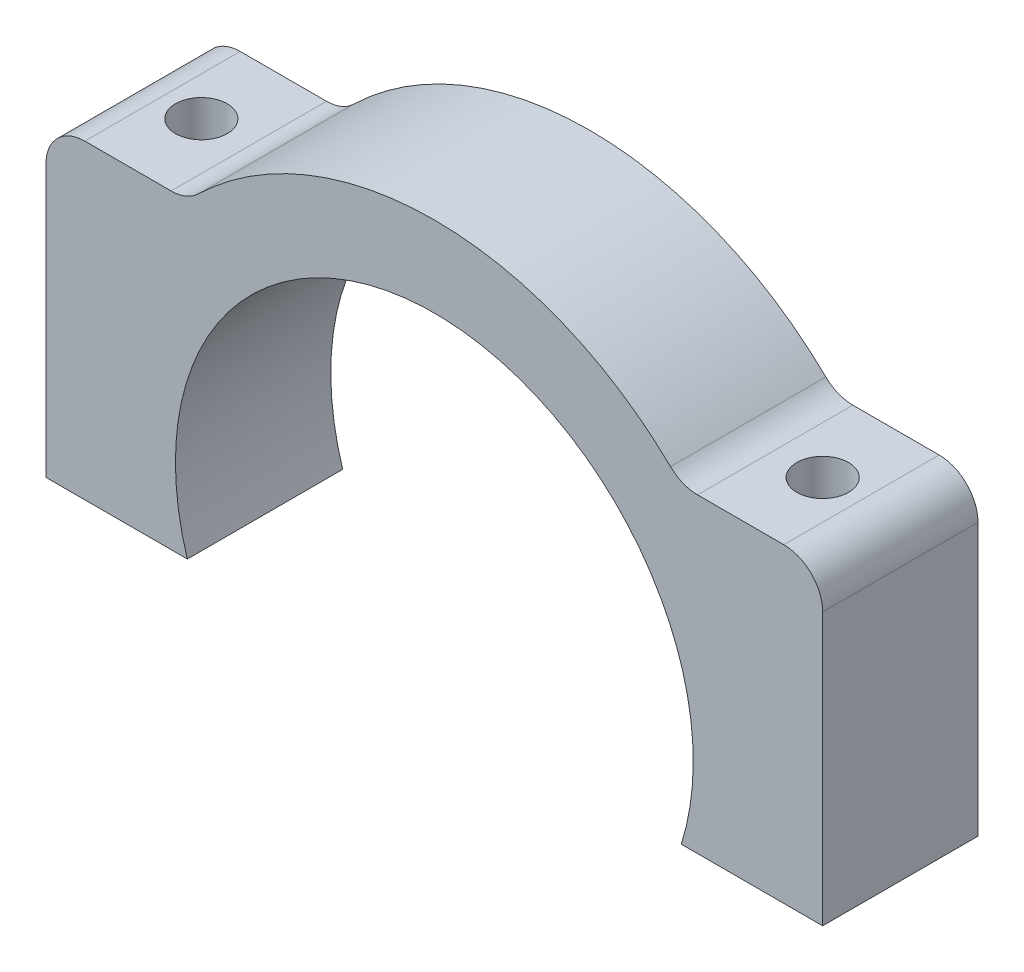
ISO-10303-21;
HEADER;
FILE_DESCRIPTION(('STEP AP214'),'2;1');
FILE_NAME('part.step','',(''),(''),'','','');
FILE_SCHEMA(('AUTOMOTIVE_DESIGN { 1 0 10303 214 1 1 1 1 }'));
ENDSEC;
DATA;
#1=APPLICATION_CONTEXT('core data for automotive mechanical design processes');
#2=APPLICATION_PROTOCOL_DEFINITION('international standard','automotive_design',2000,#1);
#3=PRODUCT_CONTEXT('',#1,'mechanical');
#4=PRODUCT('Part','Part','',(#3));
#5=PRODUCT_RELATED_PRODUCT_CATEGORY('part','',(#4));
#6=PRODUCT_DEFINITION_FORMATION('','',#4);
#7=PRODUCT_DEFINITION_CONTEXT('part definition',#1,'design');
#8=PRODUCT_DEFINITION('design','',#6,#7);
#9=PRODUCT_DEFINITION_SHAPE('','',#8);
#10=(LENGTH_UNIT() NAMED_UNIT(*) SI_UNIT(.MILLI.,.METRE.));
#11=(NAMED_UNIT(*) PLANE_ANGLE_UNIT() SI_UNIT($,.RADIAN.));
#12=(NAMED_UNIT(*) SI_UNIT($,.STERADIAN.) SOLID_ANGLE_UNIT());
#13=UNCERTAINTY_MEASURE_WITH_UNIT(LENGTH_MEASURE(1.E-05),#10,'distance_accuracy_value','');
#14=(GEOMETRIC_REPRESENTATION_CONTEXT(3) GLOBAL_UNCERTAINTY_ASSIGNED_CONTEXT((#13)) GLOBAL_UNIT_ASSIGNED_CONTEXT((#10,
#11,#12)) REPRESENTATION_CONTEXT('',''));
#15=CARTESIAN_POINT('',(0.,0.,0.));
#16=DIRECTION('',(0.,0.,1.));
#17=DIRECTION('',(1.,0.,0.));
#18=AXIS2_PLACEMENT_3D('',#15,#16,#17);
#19=CARTESIAN_POINT('',(-183.47102718992,6.00000000000001,12.));
#20=DIRECTION('',(0.,0.,-1.));
#21=DIRECTION('',(-1.,0.,0.));
#22=AXIS2_PLACEMENT_3D('',#19,#20,#21);
#23=CYLINDRICAL_SURFACE('',#22,20.0000000000001);
#24=CARTESIAN_POINT('',(-183.47102718992,6.00000000000001,0.));
#25=DIRECTION('',(0.,0.,-1.));
#26=DIRECTION('',(-1.,0.,0.));
#27=AXIS2_PLACEMENT_3D('',#24,#25,#26);
#28=CIRCLE('',#27,20.0000000000001);
#29=CARTESIAN_POINT('',(-202.549811218259,0.,0.));
#30=VERTEX_POINT('',#29);
#31=CARTESIAN_POINT('',(-164.392243161581,0.,0.));
#32=VERTEX_POINT('',#31);
#33=EDGE_CURVE('E152',#30,#32,#28,.T.);
#34=ORIENTED_EDGE('',*,*,#33,.T.);
#35=DIRECTION('',(0.,0.,-1.));
#36=VECTOR('',#35,1.);
#37=CARTESIAN_POINT('',(-164.392243161581,0.,12.));
#38=LINE('',#37,#36);
#39=CARTESIAN_POINT('',(-164.392243161581,0.,12.));
#40=VERTEX_POINT('',#39);
#41=EDGE_CURVE('E133',#40,#32,#38,.T.);
#42=ORIENTED_EDGE('',*,*,#41,.F.);
#43=CARTESIAN_POINT('',(-183.47102718992,6.00000000000001,12.));
#44=DIRECTION('',(0.,0.,-1.));
#45=DIRECTION('',(-1.,0.,0.));
#46=AXIS2_PLACEMENT_3D('',#43,#44,#45);
#47=CIRCLE('',#46,20.0000000000001);
#48=CARTESIAN_POINT('',(-202.549811218259,0.,12.));
#49=VERTEX_POINT('',#48);
#50=EDGE_CURVE('E140',#49,#40,#47,.T.);
#51=ORIENTED_EDGE('',*,*,#50,.F.);
#52=DIRECTION('',(0.,0.,-1.));
#53=VECTOR('',#52,1.);
#54=CARTESIAN_POINT('',(-202.549811218259,0.,12.));
#55=LINE('',#54,#53);
#56=EDGE_CURVE('E223',#49,#30,#55,.T.);
#57=ORIENTED_EDGE('',*,*,#56,.T.);
#58=EDGE_LOOP('',(#34,#42,#51,#57));
#59=FACE_BOUND('',#58,.T.);
#60=ADVANCED_FACE('F39',(#59),#23,.F.);
#61=CARTESIAN_POINT('',(-153.472243161581,0.,12.));
#62=DIRECTION('',(0.,1.,0.));
#63=DIRECTION('',(-1.,0.,0.));
#64=AXIS2_PLACEMENT_3D('',#61,#62,#63);
#65=PLANE('',#64);
#66=CARTESIAN_POINT('',(-159.472243161581,0.,6.00000000015));
#67=DIRECTION('',(0.,1.,0.));
#68=DIRECTION('',(-1.,0.,0.));
#69=AXIS2_PLACEMENT_3D('',#66,#67,#68);
#70=CIRCLE('',#69,2.);
#71=CARTESIAN_POINT('',(-161.472243161581,0.,6.00000000015));
#72=VERTEX_POINT('',#71);
#73=EDGE_CURVE('E253',#72,#72,#70,.F.);
#74=ORIENTED_EDGE('',*,*,#73,.F.);
#75=EDGE_LOOP('',(#74));
#76=FACE_BOUND('',#75,.T.);
#77=DIRECTION('',(1.,0.,0.));
#78=VECTOR('',#77,1.);
#79=CARTESIAN_POINT('',(-153.472243161581,0.,0.));
#80=LINE('',#79,#78);
#81=CARTESIAN_POINT('',(-153.472243161581,0.,0.));
#82=VERTEX_POINT('',#81);
#83=EDGE_CURVE('E225',#32,#82,#80,.T.);
#84=ORIENTED_EDGE('',*,*,#83,.T.);
#85=DIRECTION('',(0.,0.,-1.));
#86=VECTOR('',#85,1.);
#87=CARTESIAN_POINT('',(-153.472243161581,0.,12.));
#88=LINE('',#87,#86);
#89=CARTESIAN_POINT('',(-153.472243161581,0.,12.));
#90=VERTEX_POINT('',#89);
#91=EDGE_CURVE('E136',#90,#82,#88,.T.);
#92=ORIENTED_EDGE('',*,*,#91,.F.);
#93=DIRECTION('',(1.,0.,0.));
#94=VECTOR('',#93,1.);
#95=CARTESIAN_POINT('',(-153.472243161581,0.,12.));
#96=LINE('',#95,#94);
#97=EDGE_CURVE('E129',#40,#90,#96,.T.);
#98=ORIENTED_EDGE('',*,*,#97,.F.);
#99=ORIENTED_EDGE('',*,*,#41,.T.);
#100=EDGE_LOOP('',(#84,#92,#98,#99));
#101=FACE_BOUND('',#100,.T.);
#102=ADVANCED_FACE('F131',(#76,#101),#65,.F.);
#103=CARTESIAN_POINT('',(-153.472243161581,24.,12.));
#104=DIRECTION('',(-1.,0.,0.));
#105=DIRECTION('',(0.,0.,1.));
#106=AXIS2_PLACEMENT_3D('',#103,#104,#105);
#107=PLANE('',#106);
#108=DIRECTION('',(0.,1.,0.));
#109=VECTOR('',#108,1.);
#110=CARTESIAN_POINT('',(-153.472243161581,24.,0.));
#111=LINE('',#110,#109);
#112=CARTESIAN_POINT('',(-153.472243161581,21.,0.));
#113=VERTEX_POINT('',#112);
#114=EDGE_CURVE('E203',#82,#113,#111,.T.);
#115=ORIENTED_EDGE('',*,*,#114,.T.);
#116=DIRECTION('',(0.,0.,-1.));
#117=VECTOR('',#116,1.);
#118=CARTESIAN_POINT('',(-153.472243161581,21.,12.));
#119=LINE('',#118,#117);
#120=CARTESIAN_POINT('',(-153.472243161581,21.,12.));
#121=VERTEX_POINT('',#120);
#122=EDGE_CURVE('E167',#113,#121,#119,.F.);
#123=ORIENTED_EDGE('',*,*,#122,.T.);
#124=DIRECTION('',(0.,1.,0.));
#125=VECTOR('',#124,1.);
#126=CARTESIAN_POINT('',(-153.472243161581,24.,12.));
#127=LINE('',#126,#125);
#128=EDGE_CURVE('E139',#90,#121,#127,.T.);
#129=ORIENTED_EDGE('',*,*,#128,.F.);
#130=ORIENTED_EDGE('',*,*,#91,.T.);
#131=EDGE_LOOP('',(#115,#123,#129,#130));
#132=FACE_BOUND('',#131,.T.);
#133=ADVANCED_FACE('F245',(#132),#107,.F.);
#134=CARTESIAN_POINT('',(-164.392243161581,24.,12.));
#135=DIRECTION('',(0.,-1.,0.));
#136=DIRECTION('',(0.,0.,-1.));
#137=AXIS2_PLACEMENT_3D('',#134,#135,#136);
#138=PLANE('',#137);
#139=CARTESIAN_POINT('',(-159.472243161581,24.,6.00000000015));
#140=DIRECTION('',(0.,1.,0.));
#141=DIRECTION('',(0.,0.,1.));
#142=AXIS2_PLACEMENT_3D('',#139,#140,#141);
#143=CIRCLE('',#142,2.);
#144=CARTESIAN_POINT('',(-159.472243161581,24.,8.00000000015));
#145=VERTEX_POINT('',#144);
#146=EDGE_CURVE('E249',#145,#145,#143,.T.);
#147=ORIENTED_EDGE('',*,*,#146,.F.);
#148=EDGE_LOOP('',(#147));
#149=FACE_BOUND('',#148,.T.);
#150=DIRECTION('',(-1.,0.,0.));
#151=VECTOR('',#150,1.);
#152=CARTESIAN_POINT('',(-164.392243161581,24.,12.));
#153=LINE('',#152,#151);
#154=CARTESIAN_POINT('',(-156.472243161581,24.,12.));
#155=VERTEX_POINT('',#154);
#156=CARTESIAN_POINT('',(-163.139314901398,24.,12.));
#157=VERTEX_POINT('',#156);
#158=EDGE_CURVE('E210',#155,#157,#153,.T.);
#159=ORIENTED_EDGE('',*,*,#158,.F.);
#160=DIRECTION('',(0.,0.,-1.));
#161=VECTOR('',#160,1.);
#162=CARTESIAN_POINT('',(-156.472243161581,24.,12.));
#163=LINE('',#162,#161);
#164=CARTESIAN_POINT('',(-156.472243161581,24.,0.));
#165=VERTEX_POINT('',#164);
#166=EDGE_CURVE('E155',#155,#165,#163,.T.);
#167=ORIENTED_EDGE('',*,*,#166,.T.);
#168=DIRECTION('',(-1.,0.,0.));
#169=VECTOR('',#168,1.);
#170=CARTESIAN_POINT('',(-164.392243161581,24.,0.));
#171=LINE('',#170,#169);
#172=CARTESIAN_POINT('',(-163.139314901398,24.,0.));
#173=VERTEX_POINT('',#172);
#174=EDGE_CURVE('E192',#165,#173,#171,.T.);
#175=ORIENTED_EDGE('',*,*,#174,.T.);
#176=DIRECTION('',(0.,0.,1.));
#177=VECTOR('',#176,1.);
#178=CARTESIAN_POINT('',(-163.139314901398,24.,12.));
#179=LINE('',#178,#177);
#180=EDGE_CURVE('E153',#173,#157,#179,.T.);
#181=ORIENTED_EDGE('',*,*,#180,.T.);
#182=EDGE_LOOP('',(#159,#167,#175,#181));
#183=FACE_BOUND('',#182,.T.);
#184=ADVANCED_FACE('F200',(#149,#183),#138,.F.);
#185=CARTESIAN_POINT('',(-183.47102718992,6.00000000000001,12.));
#186=DIRECTION('',(0.,0.,-1.));
#187=DIRECTION('',(-1.,0.,0.));
#188=AXIS2_PLACEMENT_3D('',#185,#186,#187);
#189=CYLINDRICAL_SURFACE('',#188,26.2297540972081);
#190=CARTESIAN_POINT('',(-183.47102718992,6.00000000000001,0.));
#191=DIRECTION('',(0.,0.,1.));
#192=DIRECTION('',(-1.,0.,0.));
#193=AXIS2_PLACEMENT_3D('',#190,#191,#192);
#194=CIRCLE('',#193,26.2297540972081);
#195=CARTESIAN_POINT('',(-165.226063105393,24.8446619909807,0.));
#196=VERTEX_POINT('',#195);
#197=CARTESIAN_POINT('',(-201.715991274448,24.8446619909807,0.));
#198=VERTEX_POINT('',#197);
#199=EDGE_CURVE('E194',#196,#198,#194,.T.);
#200=ORIENTED_EDGE('',*,*,#199,.T.);
#201=DIRECTION('',(0.,0.,-1.));
#202=VECTOR('',#201,1.);
#203=CARTESIAN_POINT('',(-201.715991274448,24.8446619909807,12.));
#204=LINE('',#203,#202);
#205=CARTESIAN_POINT('',(-201.715991274448,24.8446619909807,12.));
#206=VERTEX_POINT('',#205);
#207=EDGE_CURVE('E182',#198,#206,#204,.F.);
#208=ORIENTED_EDGE('',*,*,#207,.T.);
#209=CARTESIAN_POINT('',(-183.47102718992,6.00000000000001,12.));
#210=DIRECTION('',(0.,0.,1.));
#211=DIRECTION('',(-1.,0.,0.));
#212=AXIS2_PLACEMENT_3D('',#209,#210,#211);
#213=CIRCLE('',#212,26.2297540972081);
#214=CARTESIAN_POINT('',(-165.226063105393,24.8446619909807,12.));
#215=VERTEX_POINT('',#214);
#216=EDGE_CURVE('E208',#215,#206,#213,.T.);
#217=ORIENTED_EDGE('',*,*,#216,.F.);
#218=DIRECTION('',(0.,0.,-1.));
#219=VECTOR('',#218,1.);
#220=CARTESIAN_POINT('',(-165.226063105393,24.8446619909807,12.));
#221=LINE('',#220,#219);
#222=EDGE_CURVE('E179',#215,#196,#221,.T.);
#223=ORIENTED_EDGE('',*,*,#222,.T.);
#224=EDGE_LOOP('',(#200,#208,#217,#223));
#225=FACE_BOUND('',#224,.T.);
#226=ADVANCED_FACE('F212',(#225),#189,.T.);
#227=CARTESIAN_POINT('',(-213.469811218259,24.,12.));
#228=DIRECTION('',(0.,-1.,0.));
#229=DIRECTION('',(0.,0.,-1.));
#230=AXIS2_PLACEMENT_3D('',#227,#228,#229);
#231=PLANE('',#230);
#232=CARTESIAN_POINT('',(-207.469811218259,24.,6.00000000015001));
#233=DIRECTION('',(0.,1.,0.));
#234=DIRECTION('',(0.,0.,1.));
#235=AXIS2_PLACEMENT_3D('',#232,#233,#234);
#236=CIRCLE('',#235,2.);
#237=CARTESIAN_POINT('',(-207.469811218259,24.,8.00000000015));
#238=VERTEX_POINT('',#237);
#239=EDGE_CURVE('E252',#238,#238,#236,.T.);
#240=ORIENTED_EDGE('',*,*,#239,.F.);
#241=EDGE_LOOP('',(#240));
#242=FACE_BOUND('',#241,.T.);
#243=DIRECTION('',(-1.,0.,0.));
#244=VECTOR('',#243,1.);
#245=CARTESIAN_POINT('',(-213.469811218259,24.,0.));
#246=LINE('',#245,#244);
#247=CARTESIAN_POINT('',(-203.802739478443,24.,0.));
#248=VERTEX_POINT('',#247);
#249=CARTESIAN_POINT('',(-210.469811218259,24.,0.));
#250=VERTEX_POINT('',#249);
#251=EDGE_CURVE('E231',#248,#250,#246,.T.);
#252=ORIENTED_EDGE('',*,*,#251,.T.);
#253=DIRECTION('',(0.,0.,-1.));
#254=VECTOR('',#253,1.);
#255=CARTESIAN_POINT('',(-210.469811218259,24.,12.));
#256=LINE('',#255,#254);
#257=CARTESIAN_POINT('',(-210.469811218259,24.,12.));
#258=VERTEX_POINT('',#257);
#259=EDGE_CURVE('E62',#250,#258,#256,.F.);
#260=ORIENTED_EDGE('',*,*,#259,.T.);
#261=DIRECTION('',(-1.,0.,0.));
#262=VECTOR('',#261,1.);
#263=CARTESIAN_POINT('',(-213.469811218259,24.,12.));
#264=LINE('',#263,#262);
#265=CARTESIAN_POINT('',(-203.802739478443,24.,12.));
#266=VERTEX_POINT('',#265);
#267=EDGE_CURVE('E214',#266,#258,#264,.T.);
#268=ORIENTED_EDGE('',*,*,#267,.F.);
#269=DIRECTION('',(0.,0.,1.));
#270=VECTOR('',#269,1.);
#271=CARTESIAN_POINT('',(-203.802739478443,24.,0.));
#272=LINE('',#271,#270);
#273=EDGE_CURVE('E175',#266,#248,#272,.F.);
#274=ORIENTED_EDGE('',*,*,#273,.T.);
#275=EDGE_LOOP('',(#252,#260,#268,#274));
#276=FACE_BOUND('',#275,.T.);
#277=ADVANCED_FACE('F263',(#242,#276),#231,.F.);
#278=CARTESIAN_POINT('',(-213.469811218259,0.,12.));
#279=DIRECTION('',(1.,0.,0.));
#280=DIRECTION('',(0.,0.,-1.));
#281=AXIS2_PLACEMENT_3D('',#278,#279,#280);
#282=PLANE('',#281);
#283=DIRECTION('',(0.,-1.,0.));
#284=VECTOR('',#283,1.);
#285=CARTESIAN_POINT('',(-213.469811218259,0.,12.));
#286=LINE('',#285,#284);
#287=CARTESIAN_POINT('',(-213.469811218259,21.,12.));
#288=VERTEX_POINT('',#287);
#289=CARTESIAN_POINT('',(-213.469811218259,0.,12.));
#290=VERTEX_POINT('',#289);
#291=EDGE_CURVE('E216',#288,#290,#286,.T.);
#292=ORIENTED_EDGE('',*,*,#291,.F.);
#293=DIRECTION('',(0.,0.,-1.));
#294=VECTOR('',#293,1.);
#295=CARTESIAN_POINT('',(-213.469811218259,21.,12.));
#296=LINE('',#295,#294);
#297=CARTESIAN_POINT('',(-213.469811218259,21.,0.));
#298=VERTEX_POINT('',#297);
#299=EDGE_CURVE('E172',#288,#298,#296,.T.);
#300=ORIENTED_EDGE('',*,*,#299,.T.);
#301=DIRECTION('',(0.,-1.,0.));
#302=VECTOR('',#301,1.);
#303=CARTESIAN_POINT('',(-213.469811218259,0.,0.));
#304=LINE('',#303,#302);
#305=CARTESIAN_POINT('',(-213.469811218259,0.,0.));
#306=VERTEX_POINT('',#305);
#307=EDGE_CURVE('E233',#298,#306,#304,.T.);
#308=ORIENTED_EDGE('',*,*,#307,.T.);
#309=DIRECTION('',(0.,0.,-1.));
#310=VECTOR('',#309,1.);
#311=CARTESIAN_POINT('',(-213.469811218259,0.,12.));
#312=LINE('',#311,#310);
#313=EDGE_CURVE('E157',#290,#306,#312,.T.);
#314=ORIENTED_EDGE('',*,*,#313,.F.);
#315=EDGE_LOOP('',(#292,#300,#308,#314));
#316=FACE_BOUND('',#315,.T.);
#317=ADVANCED_FACE('F265',(#316),#282,.F.);
#318=CARTESIAN_POINT('',(-202.549811218259,0.,12.));
#319=DIRECTION('',(0.,1.,0.));
#320=DIRECTION('',(-1.,0.,0.));
#321=AXIS2_PLACEMENT_3D('',#318,#319,#320);
#322=PLANE('',#321);
#323=CARTESIAN_POINT('',(-207.469811218259,0.,6.00000000015001));
#324=DIRECTION('',(0.,1.,0.));
#325=DIRECTION('',(-1.,0.,0.));
#326=AXIS2_PLACEMENT_3D('',#323,#324,#325);
#327=CIRCLE('',#326,2.);
#328=CARTESIAN_POINT('',(-209.469811218259,0.,6.00000000015001));
#329=VERTEX_POINT('',#328);
#330=EDGE_CURVE('E226',#329,#329,#327,.F.);
#331=ORIENTED_EDGE('',*,*,#330,.F.);
#332=EDGE_LOOP('',(#331));
#333=FACE_BOUND('',#332,.T.);
#334=DIRECTION('',(1.,0.,0.));
#335=VECTOR('',#334,1.);
#336=CARTESIAN_POINT('',(-202.549811218259,0.,0.));
#337=LINE('',#336,#335);
#338=EDGE_CURVE('E149',#306,#30,#337,.T.);
#339=ORIENTED_EDGE('',*,*,#338,.T.);
#340=ORIENTED_EDGE('',*,*,#56,.F.);
#341=DIRECTION('',(1.,0.,0.));
#342=VECTOR('',#341,1.);
#343=CARTESIAN_POINT('',(-202.549811218259,0.,12.));
#344=LINE('',#343,#342);
#345=EDGE_CURVE('E145',#290,#49,#344,.T.);
#346=ORIENTED_EDGE('',*,*,#345,.F.);
#347=ORIENTED_EDGE('',*,*,#313,.T.);
#348=EDGE_LOOP('',(#339,#340,#346,#347));
#349=FACE_BOUND('',#348,.T.);
#350=ADVANCED_FACE('F240',(#333,#349),#322,.F.);
#351=CARTESIAN_POINT('',(-183.47102718992,6.00000000000001,12.));
#352=DIRECTION('',(0.,0.,-1.));
#353=DIRECTION('',(-1.,0.,0.));
#354=AXIS2_PLACEMENT_3D('',#351,#352,#353);
#355=PLANE('',#354);
#356=ORIENTED_EDGE('',*,*,#128,.T.);
#357=CARTESIAN_POINT('',(-156.472243161581,21.,12.));
#358=DIRECTION('',(0.,0.,-1.));
#359=DIRECTION('',(-1.,0.,0.));
#360=AXIS2_PLACEMENT_3D('',#357,#358,#359);
#361=CIRCLE('',#360,3.);
#362=EDGE_CURVE('E170',#121,#155,#361,.F.);
#363=ORIENTED_EDGE('',*,*,#362,.T.);
#364=ORIENTED_EDGE('',*,*,#158,.T.);
#365=CARTESIAN_POINT('',(-163.139314901398,27.,12.));
#366=DIRECTION('',(0.,0.,-1.));
#367=DIRECTION('',(-1.,0.,0.));
#368=AXIS2_PLACEMENT_3D('',#365,#366,#367);
#369=CIRCLE('',#368,3.);
#370=EDGE_CURVE('E11',#157,#215,#369,.T.);
#371=ORIENTED_EDGE('',*,*,#370,.T.);
#372=ORIENTED_EDGE('',*,*,#216,.T.);
#373=CARTESIAN_POINT('',(-203.802739478443,27.,12.));
#374=DIRECTION('',(0.,0.,-1.));
#375=DIRECTION('',(-1.,0.,0.));
#376=AXIS2_PLACEMENT_3D('',#373,#374,#375);
#377=CIRCLE('',#376,3.);
#378=EDGE_CURVE('E186',#206,#266,#377,.T.);
#379=ORIENTED_EDGE('',*,*,#378,.T.);
#380=ORIENTED_EDGE('',*,*,#267,.T.);
#381=CARTESIAN_POINT('',(-210.469811218259,21.,12.));
#382=DIRECTION('',(0.,0.,-1.));
#383=DIRECTION('',(-1.,0.,0.));
#384=AXIS2_PLACEMENT_3D('',#381,#382,#383);
#385=CIRCLE('',#384,3.);
#386=EDGE_CURVE('E54',#258,#288,#385,.F.);
#387=ORIENTED_EDGE('',*,*,#386,.T.);
#388=ORIENTED_EDGE('',*,*,#291,.T.);
#389=ORIENTED_EDGE('',*,*,#345,.T.);
#390=ORIENTED_EDGE('',*,*,#50,.T.);
#391=ORIENTED_EDGE('',*,*,#97,.T.);
#392=EDGE_LOOP('',(#356,#363,#364,#371,#372,#379,#380,#387,#388,#389,#390,#391));
#393=FACE_BOUND('',#392,.T.);
#394=ADVANCED_FACE('F143',(#393),#355,.F.);
#395=CARTESIAN_POINT('',(-183.47102718992,6.00000000000001,0.));
#396=DIRECTION('',(0.,0.,-1.));
#397=DIRECTION('',(-1.,0.,0.));
#398=AXIS2_PLACEMENT_3D('',#395,#396,#397);
#399=PLANE('',#398);
#400=ORIENTED_EDGE('',*,*,#174,.F.);
#401=CARTESIAN_POINT('',(-156.472243161581,21.,0.));
#402=DIRECTION('',(0.,0.,-1.));
#403=DIRECTION('',(-1.,0.,0.));
#404=AXIS2_PLACEMENT_3D('',#401,#402,#403);
#405=CIRCLE('',#404,3.);
#406=EDGE_CURVE('E165',#165,#113,#405,.T.);
#407=ORIENTED_EDGE('',*,*,#406,.T.);
#408=ORIENTED_EDGE('',*,*,#114,.F.);
#409=ORIENTED_EDGE('',*,*,#83,.F.);
#410=ORIENTED_EDGE('',*,*,#33,.F.);
#411=ORIENTED_EDGE('',*,*,#338,.F.);
#412=ORIENTED_EDGE('',*,*,#307,.F.);
#413=CARTESIAN_POINT('',(-210.469811218259,21.,0.));
#414=DIRECTION('',(0.,0.,-1.));
#415=DIRECTION('',(-1.,0.,0.));
#416=AXIS2_PLACEMENT_3D('',#413,#414,#415);
#417=CIRCLE('',#416,3.);
#418=EDGE_CURVE('E163',#298,#250,#417,.T.);
#419=ORIENTED_EDGE('',*,*,#418,.T.);
#420=ORIENTED_EDGE('',*,*,#251,.F.);
#421=CARTESIAN_POINT('',(-203.802739478443,27.,0.));
#422=DIRECTION('',(0.,0.,-1.));
#423=DIRECTION('',(-1.,0.,0.));
#424=AXIS2_PLACEMENT_3D('',#421,#422,#423);
#425=CIRCLE('',#424,3.);
#426=EDGE_CURVE('E184',#248,#198,#425,.F.);
#427=ORIENTED_EDGE('',*,*,#426,.T.);
#428=ORIENTED_EDGE('',*,*,#199,.F.);
#429=CARTESIAN_POINT('',(-163.139314901398,27.,0.));
#430=DIRECTION('',(0.,0.,-1.));
#431=DIRECTION('',(-1.,0.,0.));
#432=AXIS2_PLACEMENT_3D('',#429,#430,#431);
#433=CIRCLE('',#432,3.);
#434=EDGE_CURVE('E47',#196,#173,#433,.F.);
#435=ORIENTED_EDGE('',*,*,#434,.T.);
#436=EDGE_LOOP('',(#400,#407,#408,#409,#410,#411,#412,#419,#420,#427,#428,#435));
#437=FACE_BOUND('',#436,.T.);
#438=ADVANCED_FACE('F191',(#437),#399,.T.);
#439=CARTESIAN_POINT('',(-156.472243161581,21.,12.));
#440=DIRECTION('',(0.,0.,-1.));
#441=DIRECTION('',(-1.,0.,0.));
#442=AXIS2_PLACEMENT_3D('',#439,#440,#441);
#443=CYLINDRICAL_SURFACE('',#442,3.);
#444=ORIENTED_EDGE('',*,*,#362,.F.);
#445=ORIENTED_EDGE('',*,*,#122,.F.);
#446=ORIENTED_EDGE('',*,*,#406,.F.);
#447=ORIENTED_EDGE('',*,*,#166,.F.);
#448=EDGE_LOOP('',(#444,#445,#446,#447));
#449=FACE_BOUND('',#448,.T.);
#450=ADVANCED_FACE('F291',(#449),#443,.T.);
#451=CARTESIAN_POINT('',(-210.469811218259,21.,12.));
#452=DIRECTION('',(0.,0.,-1.));
#453=DIRECTION('',(-1.,0.,0.));
#454=AXIS2_PLACEMENT_3D('',#451,#452,#453);
#455=CYLINDRICAL_SURFACE('',#454,3.);
#456=ORIENTED_EDGE('',*,*,#386,.F.);
#457=ORIENTED_EDGE('',*,*,#259,.F.);
#458=ORIENTED_EDGE('',*,*,#418,.F.);
#459=ORIENTED_EDGE('',*,*,#299,.F.);
#460=EDGE_LOOP('',(#456,#457,#458,#459));
#461=FACE_BOUND('',#460,.T.);
#462=ADVANCED_FACE('F270',(#461),#455,.T.);
#463=CARTESIAN_POINT('',(-203.802739478443,27.,12.));
#464=DIRECTION('',(0.,0.,-1.));
#465=DIRECTION('',(-1.,0.,0.));
#466=AXIS2_PLACEMENT_3D('',#463,#464,#465);
#467=CYLINDRICAL_SURFACE('',#466,3.);
#468=ORIENTED_EDGE('',*,*,#378,.F.);
#469=ORIENTED_EDGE('',*,*,#207,.F.);
#470=ORIENTED_EDGE('',*,*,#426,.F.);
#471=ORIENTED_EDGE('',*,*,#273,.F.);
#472=EDGE_LOOP('',(#468,#469,#470,#471));
#473=FACE_BOUND('',#472,.T.);
#474=ADVANCED_FACE('F296',(#473),#467,.F.);
#475=CARTESIAN_POINT('',(-163.139314901398,27.,12.));
#476=DIRECTION('',(0.,0.,-1.));
#477=DIRECTION('',(-1.,0.,0.));
#478=AXIS2_PLACEMENT_3D('',#475,#476,#477);
#479=CYLINDRICAL_SURFACE('',#478,3.);
#480=ORIENTED_EDGE('',*,*,#370,.F.);
#481=ORIENTED_EDGE('',*,*,#180,.F.);
#482=ORIENTED_EDGE('',*,*,#434,.F.);
#483=ORIENTED_EDGE('',*,*,#222,.F.);
#484=EDGE_LOOP('',(#480,#481,#482,#483));
#485=FACE_BOUND('',#484,.T.);
#486=ADVANCED_FACE('F41',(#485),#479,.F.);
#487=CARTESIAN_POINT('',(-207.469811218259,-5.65685424949238,6.00000000015001));
#488=DIRECTION('',(0.,1.,0.));
#489=DIRECTION('',(0.,0.,1.));
#490=AXIS2_PLACEMENT_3D('',#487,#488,#489);
#491=CYLINDRICAL_SURFACE('',#490,2.);
#492=ORIENTED_EDGE('',*,*,#330,.T.);
#493=EDGE_LOOP('',(#492));
#494=FACE_BOUND('',#493,.T.);
#495=ORIENTED_EDGE('',*,*,#239,.T.);
#496=EDGE_LOOP('',(#495));
#497=FACE_BOUND('',#496,.T.);
#498=ADVANCED_FACE('F261',(#494,#497),#491,.F.);
#499=CARTESIAN_POINT('',(-159.472243161581,-5.65685424949238,6.00000000015));
#500=DIRECTION('',(0.,1.,0.));
#501=DIRECTION('',(0.,0.,1.));
#502=AXIS2_PLACEMENT_3D('',#499,#500,#501);
#503=CYLINDRICAL_SURFACE('',#502,2.);
#504=ORIENTED_EDGE('',*,*,#73,.T.);
#505=EDGE_LOOP('',(#504));
#506=FACE_BOUND('',#505,.T.);
#507=ORIENTED_EDGE('',*,*,#146,.T.);
#508=EDGE_LOOP('',(#507));
#509=FACE_BOUND('',#508,.T.);
#510=ADVANCED_FACE('F305',(#506,#509),#503,.F.);
#511=CLOSED_SHELL('',(#60,#102,#133,#184,#226,#277,#317,#350,#394,#438,#450,#462,#474,#486,#498,#510));
#512=MANIFOLD_SOLID_BREP('B2',#511);
#513=ADVANCED_BREP_SHAPE_REPRESENTATION('',(#18,#512),#14);
#514=SHAPE_DEFINITION_REPRESENTATION(#9,#513);
ENDSEC;
END-ISO-10303-21;
